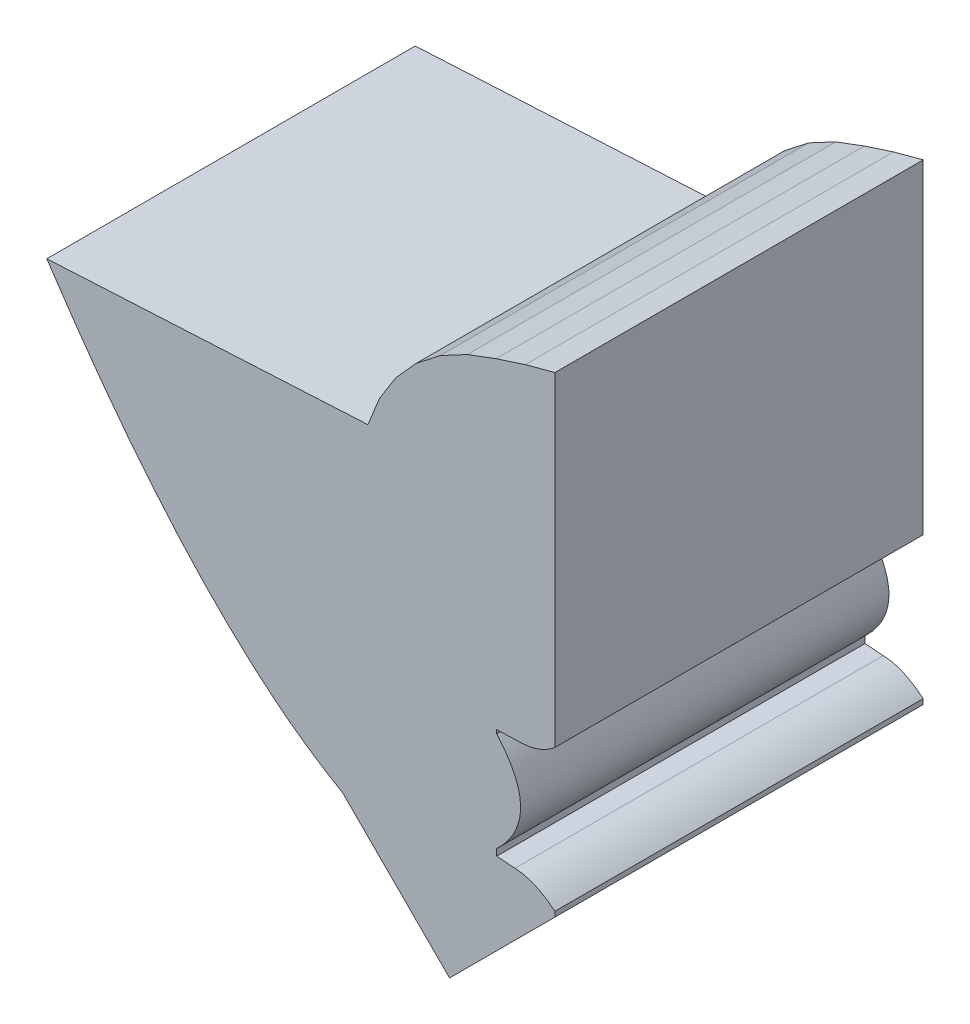
ISO-10303-21;
HEADER;
FILE_DESCRIPTION(('STEP AP214'),'2;1');
FILE_NAME('part.step','',(''),(''),'','','');
FILE_SCHEMA(('AUTOMOTIVE_DESIGN { 1 0 10303 214 1 1 1 1 }'));
ENDSEC;
DATA;
#1=APPLICATION_CONTEXT('core data for automotive mechanical design processes');
#2=APPLICATION_PROTOCOL_DEFINITION('international standard','automotive_design',2000,#1);
#3=PRODUCT_CONTEXT('',#1,'mechanical');
#4=PRODUCT('Part','Part','',(#3));
#5=PRODUCT_RELATED_PRODUCT_CATEGORY('part','',(#4));
#6=PRODUCT_DEFINITION_FORMATION('','',#4);
#7=PRODUCT_DEFINITION_CONTEXT('part definition',#1,'design');
#8=PRODUCT_DEFINITION('design','',#6,#7);
#9=PRODUCT_DEFINITION_SHAPE('','',#8);
#10=(LENGTH_UNIT() NAMED_UNIT(*) SI_UNIT(.MILLI.,.METRE.));
#11=(NAMED_UNIT(*) PLANE_ANGLE_UNIT() SI_UNIT($,.RADIAN.));
#12=(NAMED_UNIT(*) SI_UNIT($,.STERADIAN.) SOLID_ANGLE_UNIT());
#13=UNCERTAINTY_MEASURE_WITH_UNIT(LENGTH_MEASURE(1.E-05),#10,'distance_accuracy_value','');
#14=(GEOMETRIC_REPRESENTATION_CONTEXT(3) GLOBAL_UNCERTAINTY_ASSIGNED_CONTEXT((#13)) GLOBAL_UNIT_ASSIGNED_CONTEXT((#10,
#11,#12)) REPRESENTATION_CONTEXT('',''));
#15=CARTESIAN_POINT('',(0.,0.,0.));
#16=DIRECTION('',(0.,0.,1.));
#17=DIRECTION('',(1.,0.,0.));
#18=AXIS2_PLACEMENT_3D('',#15,#16,#17);
#19=CARTESIAN_POINT('',(-2.17733041778456,0.,7.21));
#20=DIRECTION('',(1.,0.,0.));
#21=DIRECTION('',(0.,1.,0.));
#22=AXIS2_PLACEMENT_3D('',#19,#20,#21);
#23=PLANE('',#22);
#24=DIRECTION('',(0.,1.,0.));
#25=VECTOR('',#24,1.);
#26=CARTESIAN_POINT('',(-2.17733041778456,0.,7.21));
#27=LINE('',#26,#25);
#28=CARTESIAN_POINT('',(-2.17733041779455,-1.68817652024789,7.21));
#29=VERTEX_POINT('',#28);
#30=CARTESIAN_POINT('',(-2.17733041778456,-1.94805703933518,7.21));
#31=VERTEX_POINT('',#30);
#32=EDGE_CURVE('E555',#29,#31,#27,.F.);
#33=ORIENTED_EDGE('',*,*,#32,.T.);
#34=DIRECTION('',(0.,0.,-1.));
#35=VECTOR('',#34,1.);
#36=CARTESIAN_POINT('',(-2.17733041778456,-1.94805703933518,7.21));
#37=LINE('',#36,#35);
#38=CARTESIAN_POINT('',(-2.17733041778456,-1.94805703933518,-7.21));
#39=VERTEX_POINT('',#38);
#40=EDGE_CURVE('E13',#31,#39,#37,.T.);
#41=ORIENTED_EDGE('',*,*,#40,.T.);
#42=DIRECTION('',(0.,1.,0.));
#43=VECTOR('',#42,1.);
#44=CARTESIAN_POINT('',(-2.17733041778456,0.,-7.21));
#45=LINE('',#44,#43);
#46=CARTESIAN_POINT('',(-2.17733041778456,-1.68817652020115,-7.21));
#47=VERTEX_POINT('',#46);
#48=EDGE_CURVE('E221',#47,#39,#45,.F.);
#49=ORIENTED_EDGE('',*,*,#48,.F.);
#50=DIRECTION('',(0.,0.,-1.));
#51=VECTOR('',#50,1.);
#52=CARTESIAN_POINT('',(-2.17733041778328,-1.68817652023794,30.8299178698776));
#53=LINE('',#52,#51);
#54=EDGE_CURVE('E591',#29,#47,#53,.T.);
#55=ORIENTED_EDGE('',*,*,#54,.F.);
#56=EDGE_LOOP('',(#33,#41,#49,#55));
#57=FACE_BOUND('',#56,.T.);
#58=ADVANCED_FACE('F59',(#57),#23,.T.);
#59=CARTESIAN_POINT('',(-82931.1005830976,996560.072871644,30.8299178698776));
#60=CARTESIAN_POINT('',(87153.8887538027,-996199.093812144,30.8299178698776));
#61=CARTESIAN_POINT('',(-91384.0928999308,995820.531871049,30.8299178698776));
#62=B_SPLINE_CURVE_WITH_KNOTS('',2,(#59,#60,#61),.UNSPECIFIED.,.F.,.F.,(3,3),(0.,1.),.UNSPECIFIED.);
#63=DIRECTION('',(0.,0.,-1.));
#64=VECTOR('',#63,1.);
#65=SURFACE_OF_LINEAR_EXTRUSION('',#62,#64);
#66=CARTESIAN_POINT('',(-10.3360060158865,-1.39847805227131,-7.21));
#67=CARTESIAN_POINT('',(-9.26374715822156,-2.21523169775302,-7.21));
#68=CARTESIAN_POINT('',(-8.21073997131228,-2.81193773958233,-7.21));
#69=B_SPLINE_CURVE_WITH_KNOTS('',2,(#66,#67,#68),.UNSPECIFIED.,.F.,.F.,(3,3),(0.500730031303645,
0.500965025000237),.UNSPECIFIED.);
#70=CARTESIAN_POINT('',(-10.3360060158632,-1.39847805228234,-7.2125366176972));
#71=VERTEX_POINT('',#70);
#72=CARTESIAN_POINT('',(-8.2107399689559,-2.81193774022767,-7.21));
#73=VERTEX_POINT('',#72);
#74=EDGE_CURVE('E551',#71,#73,#69,.T.);
#75=ORIENTED_EDGE('',*,*,#74,.T.);
#76=DIRECTION('',(0.,0.,-1.));
#77=VECTOR('',#76,1.);
#78=CARTESIAN_POINT('',(-8.21073996738564,-2.81193774179567,0.));
#79=LINE('',#78,#77);
#80=CARTESIAN_POINT('',(-8.21073997448478,-2.81193773779748,7.21));
#81=VERTEX_POINT('',#80);
#82=EDGE_CURVE('E65',#73,#81,#79,.F.);
#83=ORIENTED_EDGE('',*,*,#82,.T.);
#84=CARTESIAN_POINT('',(-8.21073997448551,-2.81193773779431,7.21));
#85=CARTESIAN_POINT('',(-9.26374715983484,-2.21523169653369,7.21));
#86=CARTESIAN_POINT('',(-10.3360060158817,-1.39847805228477,7.20999999999999));
#87=B_SPLINE_CURVE_WITH_KNOTS('',2,(#84,#85,#86),.UNSPECIFIED.,.F.,.F.,(3,3),(0.500730031304,
0.500965025000236),.UNSPECIFIED.);
#88=CARTESIAN_POINT('',(-10.3360060158816,-1.39847805227263,7.21251805157951));
#89=VERTEX_POINT('',#88);
#90=EDGE_CURVE('E523',#89,#81,#87,.F.);
#91=ORIENTED_EDGE('',*,*,#90,.F.);
#92=CARTESIAN_POINT('',(-10.336006015861,-1.39847805228632,7.21));
#93=CARTESIAN_POINT('',(-10.6228848167366,-1.17995870432205,7.21));
#94=CARTESIAN_POINT('',(-10.9111416710362,-0.945688133646021,7.21));
#95=B_SPLINE_CURVE_WITH_KNOTS('',2,(#92,#93,#94),.UNSPECIFIED.,.F.,.F.,(3,3),(0.500965025000234,
0.501027896674745),.UNSPECIFIED.);
#96=CARTESIAN_POINT('',(-10.9111416711035,-0.945688133586594,7.21251805157951));
#97=VERTEX_POINT('',#96);
#98=EDGE_CURVE('E458',#97,#89,#95,.F.);
#99=ORIENTED_EDGE('',*,*,#98,.F.);
#100=CARTESIAN_POINT('',(-10.9111416711694,-0.945688133531575,7.21));
#101=CARTESIAN_POINT('',(-15.1971813204195,2.53763911301365,7.21));
#102=CARTESIAN_POINT('',(-19.7878835648669,9.50327575735757,7.21));
#103=B_SPLINE_CURVE_WITH_KNOTS('',2,(#100,#101,#102),.UNSPECIFIED.,.F.,.F.,(3,3),
(0.501027896674761,0.501962724366634),.UNSPECIFIED.);
#104=CARTESIAN_POINT('',(-19.7878835648708,9.50327575735899,7.21251805157951));
#105=VERTEX_POINT('',#104);
#106=EDGE_CURVE('E514',#105,#97,#103,.F.);
#107=ORIENTED_EDGE('',*,*,#106,.F.);
#108=DIRECTION('',(0.,0.,1.));
#109=VECTOR('',#108,1.);
#110=CARTESIAN_POINT('',(-19.7878835648708,9.50327575735899,-7.21507323539439));
#111=LINE('',#110,#109);
#112=CARTESIAN_POINT('',(-19.7878835648708,9.50327575735899,-7.21253661769719));
#113=VERTEX_POINT('',#112);
#114=EDGE_CURVE('E361',#113,#105,#111,.T.);
#115=ORIENTED_EDGE('',*,*,#114,.F.);
#116=CARTESIAN_POINT('',(-19.7878835648714,9.50327575734023,-7.21));
#117=CARTESIAN_POINT('',(-15.197181319061,2.53763911092818,-7.21));
#118=CARTESIAN_POINT('',(-10.9111416686287,-0.945688135617351,-7.21));
#119=B_SPLINE_CURVE_WITH_KNOTS('',2,(#116,#117,#118),.UNSPECIFIED.,.F.,.F.,(3,3),
(0.501027896674483,0.501962724366634),.UNSPECIFIED.);
#120=CARTESIAN_POINT('',(-10.9111416684846,-0.945688135711886,-7.21253661769719));
#121=VERTEX_POINT('',#120);
#122=EDGE_CURVE('E501',#113,#121,#119,.T.);
#123=ORIENTED_EDGE('',*,*,#122,.T.);
#124=CARTESIAN_POINT('',(-10.9111416684921,-0.945688135713634,-7.21));
#125=CARTESIAN_POINT('',(-10.6228848154707,-1.17995870528634,-7.21));
#126=CARTESIAN_POINT('',(-10.336006015861,-1.39847805228632,-7.21));
#127=B_SPLINE_CURVE_WITH_KNOTS('',2,(#124,#125,#126),.UNSPECIFIED.,.F.,.F.,(3,3),
(0.500965025000234,0.501027896674468),.UNSPECIFIED.);
#128=EDGE_CURVE('E447',#121,#71,#127,.T.);
#129=ORIENTED_EDGE('',*,*,#128,.T.);
#130=EDGE_LOOP('',(#75,#83,#91,#99,#107,#115,#123,#129));
#131=FACE_BOUND('',#130,.T.);
#132=ADVANCED_FACE('F416',(#131),#65,.T.);
#133=DIRECTION('',(0.,1.,0.));
#134=VECTOR('',#133,1.);
#135=CARTESIAN_POINT('',(-2.17733041778456,0.,-7.21));
#136=LINE('',#135,#134);
#137=CARTESIAN_POINT('',(-2.17733041778456,2.34248700715526,-7.21));
#138=VERTEX_POINT('',#137);
#139=CARTESIAN_POINT('',(-2.17733041777607,2.20172974209443,-7.21));
#140=VERTEX_POINT('',#139);
#141=EDGE_CURVE('E539',#138,#140,#136,.F.);
#142=ORIENTED_EDGE('',*,*,#141,.F.);
#143=DIRECTION('',(0.,0.,-1.));
#144=VECTOR('',#143,1.);
#145=CARTESIAN_POINT('',(-2.17733041778456,2.34248700715526,24.0565253000013));
#146=LINE('',#145,#144);
#147=CARTESIAN_POINT('',(-2.17733041778456,2.34248700715526,7.21));
#148=VERTEX_POINT('',#147);
#149=EDGE_CURVE('E354',#148,#138,#146,.T.);
#150=ORIENTED_EDGE('',*,*,#149,.F.);
#151=DIRECTION('',(0.,1.,0.));
#152=VECTOR('',#151,1.);
#153=CARTESIAN_POINT('',(-2.17733041778456,0.,7.21));
#154=LINE('',#153,#152);
#155=CARTESIAN_POINT('',(-2.17733041778074,2.20172974210003,7.21));
#156=VERTEX_POINT('',#155);
#157=EDGE_CURVE('E550',#148,#156,#154,.F.);
#158=ORIENTED_EDGE('',*,*,#157,.T.);
#159=DIRECTION('',(0.,0.,-1.));
#160=VECTOR('',#159,1.);
#161=CARTESIAN_POINT('',(-2.17733041778074,2.20172974210003,30.8299178698776));
#162=LINE('',#161,#160);
#163=EDGE_CURVE('E647',#156,#140,#162,.T.);
#164=ORIENTED_EDGE('',*,*,#163,.T.);
#165=EDGE_LOOP('',(#142,#150,#158,#164));
#166=FACE_BOUND('',#165,.T.);
#167=ADVANCED_FACE('F423',(#166),#23,.T.);
#168=CARTESIAN_POINT('',(0.,0.,7.21));
#169=DIRECTION('',(0.,0.,1.));
#170=DIRECTION('',(1.,0.,0.));
#171=AXIS2_PLACEMENT_3D('',#168,#169,#170);
#172=PLANE('',#171);
#173=ORIENTED_EDGE('',*,*,#90,.T.);
#174=DIRECTION('',(0.707106781186544,-0.707106781186551,0.));
#175=VECTOR('',#174,1.);
#176=CARTESIAN_POINT('',(-9.62752330874333,-1.39515440044023,7.21));
#177=LINE('',#176,#175);
#178=CARTESIAN_POINT('',(-4.02267770918362,-7.,7.21));
#179=VERTEX_POINT('',#178);
#180=EDGE_CURVE('E75',#81,#179,#177,.T.);
#181=ORIENTED_EDGE('',*,*,#180,.T.);
#182=DIRECTION('',(0.70710678118655,0.707106781186545,0.));
#183=VECTOR('',#182,1.);
#184=CARTESIAN_POINT('',(0.100000000004221,-2.87732229081219,7.21));
#185=LINE('',#184,#183);
#186=CARTESIAN_POINT('',(0.100000000004221,-2.87732229081219,7.21));
#187=VERTEX_POINT('',#186);
#188=EDGE_CURVE('E250',#179,#187,#185,.T.);
#189=ORIENTED_EDGE('',*,*,#188,.T.);
#190=DIRECTION('',(-1.45337301221682E-12,1.,0.));
#191=VECTOR('',#190,1.);
#192=CARTESIAN_POINT('',(0.10000000000393,-2.67732229081219,7.21));
#193=LINE('',#192,#191);
#194=CARTESIAN_POINT('',(0.10000000000393,-2.67732229081219,7.21));
#195=VERTEX_POINT('',#194);
#196=EDGE_CURVE('E601',#187,#195,#193,.T.);
#197=ORIENTED_EDGE('',*,*,#196,.T.);
#198=CARTESIAN_POINT('',(-15454.2110469643,-999884.599969266,7.21));
#199=CARTESIAN_POINT('',(17450.9064372771,999845.695156391,7.21));
#200=CARTESIAN_POINT('',(-19453.6018275899,-999814.790343517,7.21));
#201=B_SPLINE_CURVE_WITH_KNOTS('',2,(#198,#199,#200),.UNSPECIFIED.,.F.,.F.,(3,3),(0.,1.),.UNSPECIFIED.);
#202=CARTESIAN_POINT('',(-1.46510050451637,-2.00091389878962,7.21));
#203=VERTEX_POINT('',#202);
#204=EDGE_CURVE('E598',#195,#203,#201,.T.);
#205=ORIENTED_EDGE('',*,*,#204,.T.);
#206=DIRECTION('',(-0.997257523792657,0.0740096699015593,0.));
#207=VECTOR('',#206,1.);
#208=CARTESIAN_POINT('',(-1.46510050451637,-2.00091389878962,7.21));
#209=LINE('',#208,#207);
#210=EDGE_CURVE('E230',#203,#31,#209,.T.);
#211=ORIENTED_EDGE('',*,*,#210,.T.);
#212=ORIENTED_EDGE('',*,*,#32,.F.);
#213=CARTESIAN_POINT('',(-2.17733041777607,2.20172974209443,7.21));
#214=CARTESIAN_POINT('',(-0.307419303310444,0.0931805865995528,7.21));
#215=CARTESIAN_POINT('',(-2.17733041779435,-1.68817652026,7.21));
#216=B_SPLINE_CURVE_WITH_KNOTS('',2,(#213,#214,#215),.UNSPECIFIED.,.F.,.F.,(3,3),
(0.49947186766891,0.500440643667569),.UNSPECIFIED.);
#217=EDGE_CURVE('E597',#156,#29,#216,.T.);
#218=ORIENTED_EDGE('',*,*,#217,.F.);
#219=ORIENTED_EDGE('',*,*,#157,.F.);
#220=DIRECTION('',(0.999390827019096,0.0348994967025048,0.));
#221=VECTOR('',#220,1.);
#222=CARTESIAN_POINT('',(-2.17733041778456,2.34248700715526,7.21));
#223=LINE('',#222,#221);
#224=CARTESIAN_POINT('',(-1.19050164048462,2.37694782742692,7.21000000000002));
#225=VERTEX_POINT('',#224);
#226=EDGE_CURVE('E78',#148,#225,#223,.T.);
#227=ORIENTED_EDGE('',*,*,#226,.T.);
#228=CARTESIAN_POINT('',(-343900.072311573,939011.080499257,7.21000000000001));
#229=CARTESIAN_POINT('',(342019.599581338,-939690.120785908,7.21000000000001));
#230=CARTESIAN_POINT('',(-340141.301828429,940379.16107256,7.21000000000001));
#231=B_SPLINE_CURVE_WITH_KNOTS('',2,(#228,#229,#230),.UNSPECIFIED.,.F.,.F.,(3,3),(0.,1.),.UNSPECIFIED.);
#232=CARTESIAN_POINT('',(0.100000000004221,2.87767341815847,7.21000000000001));
#233=VERTEX_POINT('',#232);
#234=EDGE_CURVE('E296',#225,#233,#231,.T.);
#235=ORIENTED_EDGE('',*,*,#234,.T.);
#236=DIRECTION('',(0.,1.,0.));
#237=VECTOR('',#236,1.);
#238=CARTESIAN_POINT('',(0.100000000004221,2.87767341815847,7.21));
#239=LINE('',#238,#237);
#240=CARTESIAN_POINT('',(0.100000000004747,15.587903347272,7.21));
#241=VERTEX_POINT('',#240);
#242=EDGE_CURVE('E335',#233,#241,#239,.T.);
#243=ORIENTED_EDGE('',*,*,#242,.T.);
#244=DIRECTION('',(-0.96592582628907,-0.258819045102515,0.));
#245=VECTOR('',#244,1.);
#246=CARTESIAN_POINT('',(-1.05911099154214,15.277320493149,7.21));
#247=LINE('',#246,#245);
#248=CARTESIAN_POINT('',(-1.05911099154214,15.277320493149,7.21000000000001));
#249=VERTEX_POINT('',#248);
#250=EDGE_CURVE('E328',#241,#249,#247,.T.);
#251=ORIENTED_EDGE('',*,*,#250,.T.);
#252=DIRECTION('',(-0.951056516295155,-0.309016994374943,0.));
#253=VECTOR('',#252,1.);
#254=CARTESIAN_POINT('',(-2.20037881109632,14.906500099899,7.21));
#255=LINE('',#254,#253);
#256=CARTESIAN_POINT('',(-2.20037881109632,14.906500099899,7.21000000000001));
#257=VERTEX_POINT('',#256);
#258=EDGE_CURVE('E326',#249,#257,#255,.T.);
#259=ORIENTED_EDGE('',*,*,#258,.T.);
#260=DIRECTION('',(-0.9366721892484,-0.350207381259461,0.));
#261=VECTOR('',#260,1.);
#262=CARTESIAN_POINT('',(-3.3243854381944,14.4862512423877,7.21));
#263=LINE('',#262,#261);
#264=CARTESIAN_POINT('',(-3.3243854381944,14.4862512423877,7.21000000000001));
#265=VERTEX_POINT('',#264);
#266=EDGE_CURVE('E324',#257,#265,#263,.T.);
#267=ORIENTED_EDGE('',*,*,#266,.T.);
#268=DIRECTION('',(-0.882947592859007,-0.46947156278574,0.));
#269=VECTOR('',#268,1.);
#270=CARTESIAN_POINT('',(-4.38392254962521,13.9228853670448,7.21));
#271=LINE('',#270,#269);
#272=CARTESIAN_POINT('',(-4.38392254962521,13.9228853670448,7.21000000000001));
#273=VERTEX_POINT('',#272);
#274=EDGE_CURVE('E318',#265,#273,#271,.T.);
#275=ORIENTED_EDGE('',*,*,#274,.T.);
#276=DIRECTION('',(-0.788010753606726,-0.615661475325654,0.));
#277=VECTOR('',#276,1.);
#278=CARTESIAN_POINT('',(-5.32953545395328,13.184091596654,7.21));
#279=LINE('',#278,#277);
#280=CARTESIAN_POINT('',(-5.32953545395328,13.184091596654,7.21000000000001));
#281=VERTEX_POINT('',#280);
#282=EDGE_CURVE('E320',#273,#281,#279,.T.);
#283=ORIENTED_EDGE('',*,*,#282,.T.);
#284=DIRECTION('',(-0.669130606358526,-0.743144825477694,0.));
#285=VECTOR('',#284,1.);
#286=CARTESIAN_POINT('',(-6.13249218158351,12.2923178060808,7.21));
#287=LINE('',#286,#285);
#288=CARTESIAN_POINT('',(-6.13249218158351,12.2923178060808,7.21000000000001));
#289=VERTEX_POINT('',#288);
#290=EDGE_CURVE('E313',#281,#289,#287,.T.);
#291=ORIENTED_EDGE('',*,*,#290,.T.);
#292=DIRECTION('',(-0.52991926423321,-0.848048096156423,0.));
#293=VECTOR('',#292,1.);
#294=CARTESIAN_POINT('',(-6.76839529866336,11.2746600906931,7.21));
#295=LINE('',#294,#293);
#296=CARTESIAN_POINT('',(-6.76839529866336,11.2746600906931,7.21000000000001));
#297=VERTEX_POINT('',#296);
#298=EDGE_CURVE('E311',#289,#297,#295,.T.);
#299=ORIENTED_EDGE('',*,*,#298,.T.);
#300=DIRECTION('',(-0.374606593415918,-0.927183854566785,0.));
#301=VECTOR('',#300,1.);
#302=CARTESIAN_POINT('',(-7.21792321076246,10.1620394652129,7.21));
#303=LINE('',#302,#301);
#304=CARTESIAN_POINT('',(-7.21792321076246,10.1620394652129,7.21000000000001));
#305=VERTEX_POINT('',#304);
#306=EDGE_CURVE('E308',#297,#305,#303,.T.);
#307=ORIENTED_EDGE('',*,*,#306,.T.);
#308=DIRECTION('',(-0.998629534754494,-0.0523359562444688,0.));
#309=VECTOR('',#308,1.);
#310=CARTESIAN_POINT('',(-10.3098203952063,10.,7.21));
#311=LINE('',#310,#309);
#312=EDGE_CURVE('E303',#305,#105,#311,.T.);
#313=ORIENTED_EDGE('',*,*,#312,.T.);
#314=ORIENTED_EDGE('',*,*,#106,.T.);
#315=ORIENTED_EDGE('',*,*,#98,.T.);
#316=EDGE_LOOP('',(#173,#181,#189,#197,#205,#211,#212,#218,#219,#227,#235,#243,#251,#259,#267,
#275,#283,#291,#299,#307,#313,#314,#315));
#317=FACE_BOUND('',#316,.T.);
#318=ADVANCED_FACE('F481',(#317),#172,.T.);
#319=CARTESIAN_POINT('',(0.,0.,-7.21));
#320=DIRECTION('',(0.,0.,1.));
#321=DIRECTION('',(1.,0.,0.));
#322=AXIS2_PLACEMENT_3D('',#319,#320,#321);
#323=PLANE('',#322);
#324=ORIENTED_EDGE('',*,*,#48,.T.);
#325=DIRECTION('',(0.997257523792657,-0.0740096699015593,0.));
#326=VECTOR('',#325,1.);
#327=CARTESIAN_POINT('',(-1.46510050451637,-2.00091389878962,-7.21));
#328=LINE('',#327,#326);
#329=CARTESIAN_POINT('',(-1.46510050451637,-2.00091389878962,-7.21));
#330=VERTEX_POINT('',#329);
#331=EDGE_CURVE('E214',#39,#330,#328,.T.);
#332=ORIENTED_EDGE('',*,*,#331,.T.);
#333=CARTESIAN_POINT('',(-15454.2110469643,-999884.599969266,-7.21));
#334=CARTESIAN_POINT('',(17450.9064372771,999845.695156391,-7.21));
#335=CARTESIAN_POINT('',(-19453.6018275899,-999814.790343517,-7.21));
#336=B_SPLINE_CURVE_WITH_KNOTS('',2,(#333,#334,#335),.UNSPECIFIED.,.F.,.F.,(3,3),(0.,1.),.UNSPECIFIED.);
#337=CARTESIAN_POINT('',(0.10000000000393,-2.67732229081219,-7.21));
#338=VERTEX_POINT('',#337);
#339=EDGE_CURVE('E219',#330,#338,#336,.F.);
#340=ORIENTED_EDGE('',*,*,#339,.T.);
#341=DIRECTION('',(1.45337301221682E-12,-1.,0.));
#342=VECTOR('',#341,1.);
#343=CARTESIAN_POINT('',(0.10000000000393,-2.67732229081219,-7.21));
#344=LINE('',#343,#342);
#345=CARTESIAN_POINT('',(0.100000000004221,-2.87732229081219,-7.21));
#346=VERTEX_POINT('',#345);
#347=EDGE_CURVE('E236',#338,#346,#344,.T.);
#348=ORIENTED_EDGE('',*,*,#347,.T.);
#349=DIRECTION('',(-0.70710678118655,-0.707106781186545,0.));
#350=VECTOR('',#349,1.);
#351=CARTESIAN_POINT('',(0.100000000004221,-2.87732229081219,-7.21));
#352=LINE('',#351,#350);
#353=CARTESIAN_POINT('',(-4.02267770918361,-7.,-7.21));
#354=VERTEX_POINT('',#353);
#355=EDGE_CURVE('E238',#346,#354,#352,.T.);
#356=ORIENTED_EDGE('',*,*,#355,.T.);
#357=DIRECTION('',(-0.707106781186544,0.707106781186551,0.));
#358=VECTOR('',#357,1.);
#359=CARTESIAN_POINT('',(-9.62752330874333,-1.39515440044023,-7.21));
#360=LINE('',#359,#358);
#361=EDGE_CURVE('E257',#354,#73,#360,.T.);
#362=ORIENTED_EDGE('',*,*,#361,.T.);
#363=ORIENTED_EDGE('',*,*,#74,.F.);
#364=ORIENTED_EDGE('',*,*,#128,.F.);
#365=ORIENTED_EDGE('',*,*,#122,.F.);
#366=DIRECTION('',(-0.998629534754494,-0.0523359562444688,0.));
#367=VECTOR('',#366,1.);
#368=CARTESIAN_POINT('',(-0.550881453784725,10.5114443180936,-7.21));
#369=LINE('',#368,#367);
#370=CARTESIAN_POINT('',(-7.21792321076246,10.1620394652129,-7.21));
#371=VERTEX_POINT('',#370);
#372=EDGE_CURVE('E526',#371,#113,#369,.T.);
#373=ORIENTED_EDGE('',*,*,#372,.F.);
#374=DIRECTION('',(0.374606593415918,0.927183854566785,0.));
#375=VECTOR('',#374,1.);
#376=CARTESIAN_POINT('',(-7.21792321076246,10.1620394652129,-7.21));
#377=LINE('',#376,#375);
#378=CARTESIAN_POINT('',(-6.76839529866336,11.2746600906931,-7.21));
#379=VERTEX_POINT('',#378);
#380=EDGE_CURVE('E274',#371,#379,#377,.T.);
#381=ORIENTED_EDGE('',*,*,#380,.T.);
#382=DIRECTION('',(0.52991926423321,0.848048096156423,0.));
#383=VECTOR('',#382,1.);
#384=CARTESIAN_POINT('',(-6.76839529866336,11.2746600906931,-7.21));
#385=LINE('',#384,#383);
#386=CARTESIAN_POINT('',(-6.13249218158351,12.2923178060808,-7.21));
#387=VERTEX_POINT('',#386);
#388=EDGE_CURVE('E272',#379,#387,#385,.T.);
#389=ORIENTED_EDGE('',*,*,#388,.T.);
#390=DIRECTION('',(0.669130606358526,0.743144825477694,0.));
#391=VECTOR('',#390,1.);
#392=CARTESIAN_POINT('',(-6.13249218158351,12.2923178060808,-7.21));
#393=LINE('',#392,#391);
#394=CARTESIAN_POINT('',(-5.32953545395328,13.184091596654,-7.21));
#395=VERTEX_POINT('',#394);
#396=EDGE_CURVE('E266',#387,#395,#393,.T.);
#397=ORIENTED_EDGE('',*,*,#396,.T.);
#398=DIRECTION('',(0.788010753606726,0.615661475325654,0.));
#399=VECTOR('',#398,1.);
#400=CARTESIAN_POINT('',(-5.32953545395328,13.184091596654,-7.21));
#401=LINE('',#400,#399);
#402=CARTESIAN_POINT('',(-4.38392254962521,13.9228853670448,-7.21));
#403=VERTEX_POINT('',#402);
#404=EDGE_CURVE('E265',#395,#403,#401,.T.);
#405=ORIENTED_EDGE('',*,*,#404,.T.);
#406=DIRECTION('',(0.882947592859007,0.46947156278574,0.));
#407=VECTOR('',#406,1.);
#408=CARTESIAN_POINT('',(-4.38392254962521,13.9228853670448,-7.21));
#409=LINE('',#408,#407);
#410=CARTESIAN_POINT('',(-3.3243854381944,14.4862512423877,-7.21));
#411=VERTEX_POINT('',#410);
#412=EDGE_CURVE('E262',#403,#411,#409,.T.);
#413=ORIENTED_EDGE('',*,*,#412,.T.);
#414=DIRECTION('',(0.9366721892484,0.350207381259461,0.));
#415=VECTOR('',#414,1.);
#416=CARTESIAN_POINT('',(-3.3243854381944,14.4862512423877,-7.21));
#417=LINE('',#416,#415);
#418=CARTESIAN_POINT('',(-2.20037881109632,14.906500099899,-7.21000000000001));
#419=VERTEX_POINT('',#418);
#420=EDGE_CURVE('E249',#411,#419,#417,.T.);
#421=ORIENTED_EDGE('',*,*,#420,.T.);
#422=DIRECTION('',(0.951056516295155,0.309016994374943,0.));
#423=VECTOR('',#422,1.);
#424=CARTESIAN_POINT('',(-2.20037881109632,14.906500099899,-7.21));
#425=LINE('',#424,#423);
#426=CARTESIAN_POINT('',(-1.05911099154214,15.277320493149,-7.21));
#427=VERTEX_POINT('',#426);
#428=EDGE_CURVE('E295',#419,#427,#425,.T.);
#429=ORIENTED_EDGE('',*,*,#428,.T.);
#430=DIRECTION('',(0.96592582628907,0.258819045102515,0.));
#431=VECTOR('',#430,1.);
#432=CARTESIAN_POINT('',(-1.05911099154214,15.277320493149,-7.21));
#433=LINE('',#432,#431);
#434=CARTESIAN_POINT('',(0.100000000004747,15.587903347272,-7.21));
#435=VERTEX_POINT('',#434);
#436=EDGE_CURVE('E293',#427,#435,#433,.T.);
#437=ORIENTED_EDGE('',*,*,#436,.T.);
#438=DIRECTION('',(0.,-1.,0.));
#439=VECTOR('',#438,1.);
#440=CARTESIAN_POINT('',(0.100000000004221,2.87767341815847,-7.21));
#441=LINE('',#440,#439);
#442=CARTESIAN_POINT('',(0.0999999999995449,2.8776734181557,-7.21000000000001));
#443=VERTEX_POINT('',#442);
#444=EDGE_CURVE('E285',#435,#443,#441,.T.);
#445=ORIENTED_EDGE('',*,*,#444,.T.);
#446=CARTESIAN_POINT('',(-343900.072311573,939011.080499257,-7.21000000000001));
#447=CARTESIAN_POINT('',(342019.599581338,-939690.120785908,-7.21000000000001));
#448=CARTESIAN_POINT('',(-340141.301828429,940379.16107256,-7.21000000000001));
#449=B_SPLINE_CURVE_WITH_KNOTS('',2,(#446,#447,#448),.UNSPECIFIED.,.F.,.F.,(3,3),(0.,1.),.UNSPECIFIED.);
#450=CARTESIAN_POINT('',(-1.19050164048462,2.37694782741517,-7.21));
#451=VERTEX_POINT('',#450);
#452=EDGE_CURVE('E280',#443,#451,#449,.F.);
#453=ORIENTED_EDGE('',*,*,#452,.T.);
#454=DIRECTION('',(-0.999390827019096,-0.0348994967025048,0.));
#455=VECTOR('',#454,1.);
#456=CARTESIAN_POINT('',(-2.17733041778456,2.34248700715526,-7.21));
#457=LINE('',#456,#455);
#458=EDGE_CURVE('E277',#451,#138,#457,.T.);
#459=ORIENTED_EDGE('',*,*,#458,.T.);
#460=ORIENTED_EDGE('',*,*,#141,.T.);
#461=CARTESIAN_POINT('',(-2.17733041776379,-1.68817652023098,-7.21));
#462=CARTESIAN_POINT('',(-0.307419303328964,0.0931805866132554,-7.21));
#463=CARTESIAN_POINT('',(-2.17733041776824,2.20172974208621,-7.21));
#464=B_SPLINE_CURVE_WITH_KNOTS('',2,(#461,#462,#463),.UNSPECIFIED.,.F.,.F.,(3,3),
(0.499471867668912,0.500440643667561),.UNSPECIFIED.);
#465=EDGE_CURVE('E648',#47,#140,#464,.T.);
#466=ORIENTED_EDGE('',*,*,#465,.F.);
#467=EDGE_LOOP('',(#324,#332,#340,#348,#356,#362,#363,#364,#365,#373,#381,#389,#397,#405,#413,
#421,#429,#437,#445,#453,#459,#460,#466));
#468=FACE_BOUND('',#467,.T.);
#469=ADVANCED_FACE('F215',(#468),#323,.F.);
#470=CARTESIAN_POINT('',(-996021.636606251,89148.1321438377,30.8299178698776));
#471=CARTESIAN_POINT('',(996193.448091746,-87155.7427476542,30.8299178698776));
#472=CARTESIAN_POINT('',(-996370.259577241,85163.3533514707,30.8299178698776));
#473=B_SPLINE_CURVE_WITH_KNOTS('',2,(#470,#471,#472),.UNSPECIFIED.,.F.,.F.,(3,3),(0.,1.),.UNSPECIFIED.);
#474=DIRECTION('',(0.,0.,-1.));
#475=VECTOR('',#474,1.);
#476=SURFACE_OF_LINEAR_EXTRUSION('',#473,#475);
#477=ORIENTED_EDGE('',*,*,#163,.F.);
#478=ORIENTED_EDGE('',*,*,#217,.T.);
#479=ORIENTED_EDGE('',*,*,#54,.T.);
#480=ORIENTED_EDGE('',*,*,#465,.T.);
#481=EDGE_LOOP('',(#477,#478,#479,#480));
#482=FACE_BOUND('',#481,.T.);
#483=ADVANCED_FACE('F413',(#482),#476,.T.);
#484=CARTESIAN_POINT('',(-19.7878835648708,9.50327575735899,-7.21507323539439));
#485=DIRECTION('',(-0.0523359562444688,0.998629534754494,0.));
#486=DIRECTION('',(-0.998629534754494,-0.0523359562444688,0.));
#487=AXIS2_PLACEMENT_3D('',#484,#485,#486);
#488=PLANE('',#487);
#489=ORIENTED_EDGE('',*,*,#312,.F.);
#490=DIRECTION('',(0.,0.,-1.));
#491=VECTOR('',#490,1.);
#492=CARTESIAN_POINT('',(-7.21792321076246,10.1620394652129,24.0565253000013));
#493=LINE('',#492,#491);
#494=EDGE_CURVE('E350',#305,#371,#493,.T.);
#495=ORIENTED_EDGE('',*,*,#494,.T.);
#496=ORIENTED_EDGE('',*,*,#372,.T.);
#497=ORIENTED_EDGE('',*,*,#114,.T.);
#498=EDGE_LOOP('',(#489,#495,#496,#497));
#499=FACE_BOUND('',#498,.T.);
#500=ADVANCED_FACE('F410',(#499),#488,.T.);
#501=CARTESIAN_POINT('',(-1.05911099154214,15.277320493149,24.0565253000013));
#502=DIRECTION('',(0.258819045102515,-0.96592582628907,0.));
#503=DIRECTION('',(0.96592582628907,0.258819045102515,0.));
#504=AXIS2_PLACEMENT_3D('',#501,#502,#503);
#505=PLANE('',#504);
#506=ORIENTED_EDGE('',*,*,#250,.F.);
#507=DIRECTION('',(0.,0.,-1.));
#508=VECTOR('',#507,1.);
#509=CARTESIAN_POINT('',(0.100000000004747,15.587903347272,24.0565253000013));
#510=LINE('',#509,#508);
#511=EDGE_CURVE('E300',#241,#435,#510,.T.);
#512=ORIENTED_EDGE('',*,*,#511,.T.);
#513=ORIENTED_EDGE('',*,*,#436,.F.);
#514=DIRECTION('',(0.,0.,-1.));
#515=VECTOR('',#514,1.);
#516=CARTESIAN_POINT('',(-1.05911099154214,15.277320493149,24.0565253000013));
#517=LINE('',#516,#515);
#518=EDGE_CURVE('E337',#249,#427,#517,.T.);
#519=ORIENTED_EDGE('',*,*,#518,.F.);
#520=EDGE_LOOP('',(#506,#512,#513,#519));
#521=FACE_BOUND('',#520,.T.);
#522=ADVANCED_FACE('F406',(#521),#505,.F.);
#523=CARTESIAN_POINT('',(-2.20037881109632,14.906500099899,24.0565253000013));
#524=DIRECTION('',(0.309016994374943,-0.951056516295155,0.));
#525=DIRECTION('',(0.951056516295155,0.309016994374943,0.));
#526=AXIS2_PLACEMENT_3D('',#523,#524,#525);
#527=PLANE('',#526);
#528=ORIENTED_EDGE('',*,*,#258,.F.);
#529=ORIENTED_EDGE('',*,*,#518,.T.);
#530=ORIENTED_EDGE('',*,*,#428,.F.);
#531=DIRECTION('',(0.,0.,-1.));
#532=VECTOR('',#531,1.);
#533=CARTESIAN_POINT('',(-2.20037881109632,14.906500099899,24.0565253000013));
#534=LINE('',#533,#532);
#535=EDGE_CURVE('E336',#257,#419,#534,.T.);
#536=ORIENTED_EDGE('',*,*,#535,.F.);
#537=EDGE_LOOP('',(#528,#529,#530,#536));
#538=FACE_BOUND('',#537,.T.);
#539=ADVANCED_FACE('F405',(#538),#527,.F.);
#540=CARTESIAN_POINT('',(-3.3243854381944,14.4862512423877,24.0565253000013));
#541=DIRECTION('',(0.350207381259461,-0.9366721892484,0.));
#542=DIRECTION('',(0.9366721892484,0.350207381259461,0.));
#543=AXIS2_PLACEMENT_3D('',#540,#541,#542);
#544=PLANE('',#543);
#545=ORIENTED_EDGE('',*,*,#266,.F.);
#546=ORIENTED_EDGE('',*,*,#535,.T.);
#547=ORIENTED_EDGE('',*,*,#420,.F.);
#548=DIRECTION('',(0.,0.,-1.));
#549=VECTOR('',#548,1.);
#550=CARTESIAN_POINT('',(-3.3243854381944,14.4862512423877,24.0565253000013));
#551=LINE('',#550,#549);
#552=EDGE_CURVE('E338',#265,#411,#551,.T.);
#553=ORIENTED_EDGE('',*,*,#552,.F.);
#554=EDGE_LOOP('',(#545,#546,#547,#553));
#555=FACE_BOUND('',#554,.T.);
#556=ADVANCED_FACE('F396',(#555),#544,.F.);
#557=CARTESIAN_POINT('',(-4.38392254962521,13.9228853670448,24.0565253000013));
#558=DIRECTION('',(0.46947156278574,-0.882947592859007,0.));
#559=DIRECTION('',(0.882947592859007,0.46947156278574,0.));
#560=AXIS2_PLACEMENT_3D('',#557,#558,#559);
#561=PLANE('',#560);
#562=ORIENTED_EDGE('',*,*,#274,.F.);
#563=ORIENTED_EDGE('',*,*,#552,.T.);
#564=ORIENTED_EDGE('',*,*,#412,.F.);
#565=DIRECTION('',(0.,0.,-1.));
#566=VECTOR('',#565,1.);
#567=CARTESIAN_POINT('',(-4.38392254962521,13.9228853670448,24.0565253000013));
#568=LINE('',#567,#566);
#569=EDGE_CURVE('E342',#273,#403,#568,.T.);
#570=ORIENTED_EDGE('',*,*,#569,.F.);
#571=EDGE_LOOP('',(#562,#563,#564,#570));
#572=FACE_BOUND('',#571,.T.);
#573=ADVANCED_FACE('F393',(#572),#561,.F.);
#574=CARTESIAN_POINT('',(-5.32953545395328,13.184091596654,24.0565253000013));
#575=DIRECTION('',(0.615661475325654,-0.788010753606726,0.));
#576=DIRECTION('',(0.788010753606726,0.615661475325654,0.));
#577=AXIS2_PLACEMENT_3D('',#574,#575,#576);
#578=PLANE('',#577);
#579=ORIENTED_EDGE('',*,*,#282,.F.);
#580=ORIENTED_EDGE('',*,*,#569,.T.);
#581=ORIENTED_EDGE('',*,*,#404,.F.);
#582=DIRECTION('',(0.,0.,-1.));
#583=VECTOR('',#582,1.);
#584=CARTESIAN_POINT('',(-5.32953545395328,13.184091596654,24.0565253000013));
#585=LINE('',#584,#583);
#586=EDGE_CURVE('E343',#281,#395,#585,.T.);
#587=ORIENTED_EDGE('',*,*,#586,.F.);
#588=EDGE_LOOP('',(#579,#580,#581,#587));
#589=FACE_BOUND('',#588,.T.);
#590=ADVANCED_FACE('F390',(#589),#578,.F.);
#591=CARTESIAN_POINT('',(-6.13249218158351,12.2923178060808,24.0565253000013));
#592=DIRECTION('',(0.743144825477693,-0.669130606358526,0.));
#593=DIRECTION('',(0.669130606358526,0.743144825477694,0.));
#594=AXIS2_PLACEMENT_3D('',#591,#592,#593);
#595=PLANE('',#594);
#596=ORIENTED_EDGE('',*,*,#290,.F.);
#597=ORIENTED_EDGE('',*,*,#586,.T.);
#598=ORIENTED_EDGE('',*,*,#396,.F.);
#599=DIRECTION('',(0.,0.,-1.));
#600=VECTOR('',#599,1.);
#601=CARTESIAN_POINT('',(-6.13249218158351,12.2923178060808,24.0565253000013));
#602=LINE('',#601,#600);
#603=EDGE_CURVE('E346',#289,#387,#602,.T.);
#604=ORIENTED_EDGE('',*,*,#603,.F.);
#605=EDGE_LOOP('',(#596,#597,#598,#604));
#606=FACE_BOUND('',#605,.T.);
#607=ADVANCED_FACE('F386',(#606),#595,.F.);
#608=CARTESIAN_POINT('',(-6.76839529866336,11.2746600906931,24.0565253000013));
#609=DIRECTION('',(0.848048096156423,-0.52991926423321,0.));
#610=DIRECTION('',(0.52991926423321,0.848048096156423,0.));
#611=AXIS2_PLACEMENT_3D('',#608,#609,#610);
#612=PLANE('',#611);
#613=ORIENTED_EDGE('',*,*,#298,.F.);
#614=ORIENTED_EDGE('',*,*,#603,.T.);
#615=ORIENTED_EDGE('',*,*,#388,.F.);
#616=DIRECTION('',(0.,0.,-1.));
#617=VECTOR('',#616,1.);
#618=CARTESIAN_POINT('',(-6.76839529866336,11.2746600906931,24.0565253000013));
#619=LINE('',#618,#617);
#620=EDGE_CURVE('E349',#297,#379,#619,.T.);
#621=ORIENTED_EDGE('',*,*,#620,.F.);
#622=EDGE_LOOP('',(#613,#614,#615,#621));
#623=FACE_BOUND('',#622,.T.);
#624=ADVANCED_FACE('F385',(#623),#612,.F.);
#625=CARTESIAN_POINT('',(-7.21792321076246,10.1620394652129,24.0565253000013));
#626=DIRECTION('',(0.927183854566785,-0.374606593415918,0.));
#627=DIRECTION('',(0.374606593415918,0.927183854566785,0.));
#628=AXIS2_PLACEMENT_3D('',#625,#626,#627);
#629=PLANE('',#628);
#630=ORIENTED_EDGE('',*,*,#306,.F.);
#631=ORIENTED_EDGE('',*,*,#620,.T.);
#632=ORIENTED_EDGE('',*,*,#380,.F.);
#633=ORIENTED_EDGE('',*,*,#494,.F.);
#634=EDGE_LOOP('',(#630,#631,#632,#633));
#635=FACE_BOUND('',#634,.T.);
#636=ADVANCED_FACE('F378',(#635),#629,.F.);
#637=CARTESIAN_POINT('',(-2.17733041778456,2.34248700715526,24.0565253000013));
#638=DIRECTION('',(-0.0348994967025048,0.999390827019096,0.));
#639=DIRECTION('',(-0.999390827019096,-0.0348994967025048,0.));
#640=AXIS2_PLACEMENT_3D('',#637,#638,#639);
#641=PLANE('',#640);
#642=ORIENTED_EDGE('',*,*,#226,.F.);
#643=ORIENTED_EDGE('',*,*,#149,.T.);
#644=ORIENTED_EDGE('',*,*,#458,.F.);
#645=DIRECTION('',(0.,0.,-1.));
#646=VECTOR('',#645,1.);
#647=CARTESIAN_POINT('',(-1.19050164048462,2.37694782742692,24.0565253000013));
#648=LINE('',#647,#646);
#649=EDGE_CURVE('E355',#225,#451,#648,.T.);
#650=ORIENTED_EDGE('',*,*,#649,.F.);
#651=EDGE_LOOP('',(#642,#643,#644,#650));
#652=FACE_BOUND('',#651,.T.);
#653=ADVANCED_FACE('F372',(#652),#641,.F.);
#654=CARTESIAN_POINT('',(-343900.072311573,939011.080499257,24.0565253000013));
#655=CARTESIAN_POINT('',(342019.599581338,-939690.120785908,24.0565253000013));
#656=CARTESIAN_POINT('',(-340141.301828429,940379.16107256,24.0565253000013));
#657=B_SPLINE_CURVE_WITH_KNOTS('',2,(#654,#655,#656),.UNSPECIFIED.,.F.,.F.,(3,3),(0.,1.),.UNSPECIFIED.);
#658=DIRECTION('',(0.,0.,-1.));
#659=VECTOR('',#658,1.);
#660=SURFACE_OF_LINEAR_EXTRUSION('',#657,#659);
#661=ORIENTED_EDGE('',*,*,#234,.F.);
#662=ORIENTED_EDGE('',*,*,#649,.T.);
#663=ORIENTED_EDGE('',*,*,#452,.F.);
#664=DIRECTION('',(0.,0.,-1.));
#665=VECTOR('',#664,1.);
#666=CARTESIAN_POINT('',(0.100000000004221,2.87767341815847,24.0565253000013));
#667=LINE('',#666,#665);
#668=EDGE_CURVE('E332',#233,#443,#667,.T.);
#669=ORIENTED_EDGE('',*,*,#668,.F.);
#670=EDGE_LOOP('',(#661,#662,#663,#669));
#671=FACE_BOUND('',#670,.T.);
#672=ADVANCED_FACE('F367',(#671),#660,.F.);
#673=CARTESIAN_POINT('',(0.100000000004221,2.87767341815847,24.0565253000013));
#674=DIRECTION('',(-1.,0.,0.));
#675=DIRECTION('',(0.,-1.,0.));
#676=AXIS2_PLACEMENT_3D('',#673,#674,#675);
#677=PLANE('',#676);
#678=ORIENTED_EDGE('',*,*,#242,.F.);
#679=ORIENTED_EDGE('',*,*,#668,.T.);
#680=ORIENTED_EDGE('',*,*,#444,.F.);
#681=ORIENTED_EDGE('',*,*,#511,.F.);
#682=EDGE_LOOP('',(#678,#679,#680,#681));
#683=FACE_BOUND('',#682,.T.);
#684=ADVANCED_FACE('F373',(#683),#677,.F.);
#685=CARTESIAN_POINT('',(-15454.2110469643,-999884.599969266,18.4367093984477));
#686=CARTESIAN_POINT('',(17450.9064372771,999845.695156391,18.4367093984477));
#687=CARTESIAN_POINT('',(-19453.6018275899,-999814.790343517,18.4367093984477));
#688=B_SPLINE_CURVE_WITH_KNOTS('',2,(#685,#686,#687),.UNSPECIFIED.,.F.,.F.,(3,3),(0.,1.),.UNSPECIFIED.);
#689=DIRECTION('',(0.,0.,-1.));
#690=VECTOR('',#689,1.);
#691=SURFACE_OF_LINEAR_EXTRUSION('',#688,#690);
#692=ORIENTED_EDGE('',*,*,#204,.F.);
#693=DIRECTION('',(0.,0.,-1.));
#694=VECTOR('',#693,1.);
#695=CARTESIAN_POINT('',(0.10000000000393,-2.67732229081219,18.4367093984477));
#696=LINE('',#695,#694);
#697=EDGE_CURVE('E224',#195,#338,#696,.T.);
#698=ORIENTED_EDGE('',*,*,#697,.T.);
#699=ORIENTED_EDGE('',*,*,#339,.F.);
#700=DIRECTION('',(0.,0.,-1.));
#701=VECTOR('',#700,1.);
#702=CARTESIAN_POINT('',(-1.46510050451637,-2.00091389878962,18.4367093984477));
#703=LINE('',#702,#701);
#704=EDGE_CURVE('E228',#203,#330,#703,.T.);
#705=ORIENTED_EDGE('',*,*,#704,.F.);
#706=EDGE_LOOP('',(#692,#698,#699,#705));
#707=FACE_BOUND('',#706,.T.);
#708=ADVANCED_FACE('F232',(#707),#691,.F.);
#709=CARTESIAN_POINT('',(-1.46510050451637,-2.00091389878962,18.4367093984477));
#710=DIRECTION('',(-0.0740096699015593,-0.997257523792657,0.));
#711=DIRECTION('',(0.997257523792657,-0.0740096699015593,0.));
#712=AXIS2_PLACEMENT_3D('',#709,#710,#711);
#713=PLANE('',#712);
#714=ORIENTED_EDGE('',*,*,#40,.F.);
#715=ORIENTED_EDGE('',*,*,#210,.F.);
#716=ORIENTED_EDGE('',*,*,#704,.T.);
#717=ORIENTED_EDGE('',*,*,#331,.F.);
#718=EDGE_LOOP('',(#714,#715,#716,#717));
#719=FACE_BOUND('',#718,.T.);
#720=ADVANCED_FACE('F227',(#719),#713,.F.);
#721=CARTESIAN_POINT('',(-9.62752330874333,-1.39515440044023,18.4367093984477));
#722=DIRECTION('',(0.707106781186551,0.707106781186544,0.));
#723=DIRECTION('',(-0.707106781186544,0.707106781186551,0.));
#724=AXIS2_PLACEMENT_3D('',#721,#722,#723);
#725=PLANE('',#724);
#726=ORIENTED_EDGE('',*,*,#82,.F.);
#727=ORIENTED_EDGE('',*,*,#361,.F.);
#728=DIRECTION('',(0.,0.,-1.));
#729=VECTOR('',#728,1.);
#730=CARTESIAN_POINT('',(-4.02267770918362,-7.,18.4367093984477));
#731=LINE('',#730,#729);
#732=EDGE_CURVE('E231',#179,#354,#731,.T.);
#733=ORIENTED_EDGE('',*,*,#732,.F.);
#734=ORIENTED_EDGE('',*,*,#180,.F.);
#735=EDGE_LOOP('',(#726,#727,#733,#734));
#736=FACE_BOUND('',#735,.T.);
#737=ADVANCED_FACE('F625',(#736),#725,.F.);
#738=CARTESIAN_POINT('',(0.100000000004221,-2.87732229081219,18.4367093984477));
#739=DIRECTION('',(-0.707106781186545,0.70710678118655,0.));
#740=DIRECTION('',(-0.70710678118655,-0.707106781186545,0.));
#741=AXIS2_PLACEMENT_3D('',#738,#739,#740);
#742=PLANE('',#741);
#743=ORIENTED_EDGE('',*,*,#188,.F.);
#744=ORIENTED_EDGE('',*,*,#732,.T.);
#745=ORIENTED_EDGE('',*,*,#355,.F.);
#746=DIRECTION('',(0.,0.,-1.));
#747=VECTOR('',#746,1.);
#748=CARTESIAN_POINT('',(0.100000000004221,-2.87732229081219,18.4367093984477));
#749=LINE('',#748,#747);
#750=EDGE_CURVE('E602',#187,#346,#749,.T.);
#751=ORIENTED_EDGE('',*,*,#750,.F.);
#752=EDGE_LOOP('',(#743,#744,#745,#751));
#753=FACE_BOUND('',#752,.T.);
#754=ADVANCED_FACE('F622',(#753),#742,.F.);
#755=CARTESIAN_POINT('',(0.10000000000393,-2.67732229081219,18.4367093984477));
#756=DIRECTION('',(-1.,-1.45337301221682E-12,0.));
#757=DIRECTION('',(1.45337301221682E-12,-1.,0.));
#758=AXIS2_PLACEMENT_3D('',#755,#756,#757);
#759=PLANE('',#758);
#760=ORIENTED_EDGE('',*,*,#196,.F.);
#761=ORIENTED_EDGE('',*,*,#750,.T.);
#762=ORIENTED_EDGE('',*,*,#347,.F.);
#763=ORIENTED_EDGE('',*,*,#697,.F.);
#764=EDGE_LOOP('',(#760,#761,#762,#763));
#765=FACE_BOUND('',#764,.T.);
#766=ADVANCED_FACE('F628',(#765),#759,.F.);
#767=CLOSED_SHELL('',(#58,#132,#167,#318,#469,#483,#500,#522,#539,#556,#573,#590,#607,#624,#636,
#653,#672,#684,#708,#720,#737,#754,#766));
#768=MANIFOLD_SOLID_BREP('B2',#767);
#769=ADVANCED_BREP_SHAPE_REPRESENTATION('',(#18,#768),#14);
#770=SHAPE_DEFINITION_REPRESENTATION(#9,#769);
ENDSEC;
END-ISO-10303-21;
